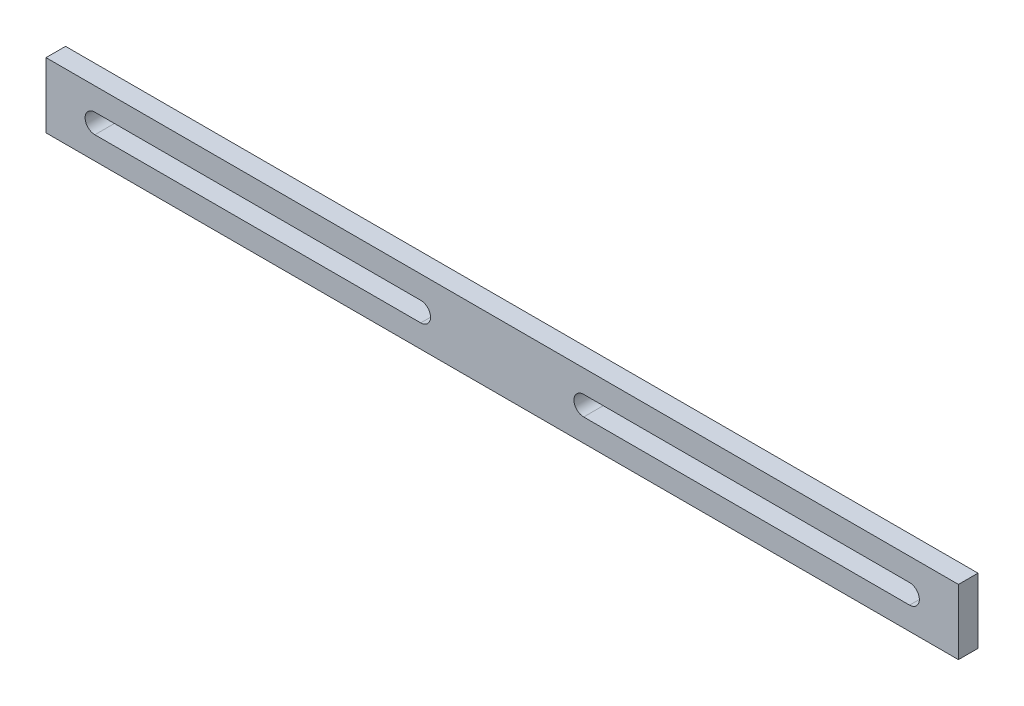
ISO-10303-21;
HEADER;
FILE_DESCRIPTION(('STEP AP214'),'2;1');
FILE_NAME('part.step','',(''),(''),'','','');
FILE_SCHEMA(('AUTOMOTIVE_DESIGN { 1 0 10303 214 1 1 1 1 }'));
ENDSEC;
DATA;
#1=APPLICATION_CONTEXT('core data for automotive mechanical design processes');
#2=APPLICATION_PROTOCOL_DEFINITION('international standard','automotive_design',2000,#1);
#3=PRODUCT_CONTEXT('',#1,'mechanical');
#4=PRODUCT('Part','Part','',(#3));
#5=PRODUCT_RELATED_PRODUCT_CATEGORY('part','',(#4));
#6=PRODUCT_DEFINITION_FORMATION('','',#4);
#7=PRODUCT_DEFINITION_CONTEXT('part definition',#1,'design');
#8=PRODUCT_DEFINITION('design','',#6,#7);
#9=PRODUCT_DEFINITION_SHAPE('','',#8);
#10=(LENGTH_UNIT() NAMED_UNIT(*) SI_UNIT(.MILLI.,.METRE.));
#11=(NAMED_UNIT(*) PLANE_ANGLE_UNIT() SI_UNIT($,.RADIAN.));
#12=(NAMED_UNIT(*) SI_UNIT($,.STERADIAN.) SOLID_ANGLE_UNIT());
#13=UNCERTAINTY_MEASURE_WITH_UNIT(LENGTH_MEASURE(1.E-05),#10,'distance_accuracy_value','');
#14=(GEOMETRIC_REPRESENTATION_CONTEXT(3) GLOBAL_UNCERTAINTY_ASSIGNED_CONTEXT((#13)) GLOBAL_UNIT_ASSIGNED_CONTEXT((#10,
#11,#12)) REPRESENTATION_CONTEXT('',''));
#15=CARTESIAN_POINT('',(0.,0.,0.));
#16=DIRECTION('',(0.,0.,1.));
#17=DIRECTION('',(1.,0.,0.));
#18=AXIS2_PLACEMENT_3D('',#15,#16,#17);
#19=CARTESIAN_POINT('',(0.,0.,6.));
#20=DIRECTION('',(0.,0.,-1.));
#21=DIRECTION('',(-1.,0.,0.));
#22=AXIS2_PLACEMENT_3D('',#19,#20,#21);
#23=PLANE('',#22);
#24=CARTESIAN_POINT('',(15.,10.,6.));
#25=DIRECTION('',(0.,0.,1.));
#26=DIRECTION('',(1.,0.,0.));
#27=AXIS2_PLACEMENT_3D('',#24,#25,#26);
#28=CIRCLE('',#27,3.);
#29=CARTESIAN_POINT('',(15.,13.,6.));
#30=VERTEX_POINT('',#29);
#31=CARTESIAN_POINT('',(15.,7.,6.));
#32=VERTEX_POINT('',#31);
#33=EDGE_CURVE('E166',#30,#32,#28,.T.);
#34=ORIENTED_EDGE('',*,*,#33,.F.);
#35=DIRECTION('',(-1.,0.,0.));
#36=VECTOR('',#35,1.);
#37=CARTESIAN_POINT('',(15.,13.,6.));
#38=LINE('',#37,#36);
#39=CARTESIAN_POINT('',(115.,13.,6.));
#40=VERTEX_POINT('',#39);
#41=EDGE_CURVE('E174',#40,#30,#38,.T.);
#42=ORIENTED_EDGE('',*,*,#41,.F.);
#43=CARTESIAN_POINT('',(115.,10.,6.));
#44=DIRECTION('',(0.,0.,1.));
#45=DIRECTION('',(1.,0.,0.));
#46=AXIS2_PLACEMENT_3D('',#43,#44,#45);
#47=CIRCLE('',#46,3.);
#48=CARTESIAN_POINT('',(115.,7.00000000000002,6.));
#49=VERTEX_POINT('',#48);
#50=EDGE_CURVE('E171',#49,#40,#47,.T.);
#51=ORIENTED_EDGE('',*,*,#50,.F.);
#52=DIRECTION('',(1.,0.,0.));
#53=VECTOR('',#52,1.);
#54=CARTESIAN_POINT('',(15.,7.,6.));
#55=LINE('',#54,#53);
#56=EDGE_CURVE('E168',#32,#49,#55,.T.);
#57=ORIENTED_EDGE('',*,*,#56,.F.);
#58=EDGE_LOOP('',(#34,#42,#51,#57));
#59=FACE_BOUND('',#58,.T.);
#60=DIRECTION('',(0.,-1.,0.));
#61=VECTOR('',#60,1.);
#62=CARTESIAN_POINT('',(0.,0.,6.));
#63=LINE('',#62,#61);
#64=CARTESIAN_POINT('',(0.,20.,6.));
#65=VERTEX_POINT('',#64);
#66=CARTESIAN_POINT('',(0.,0.,6.));
#67=VERTEX_POINT('',#66);
#68=EDGE_CURVE('E197',#65,#67,#63,.T.);
#69=ORIENTED_EDGE('',*,*,#68,.T.);
#70=DIRECTION('',(1.,0.,0.));
#71=VECTOR('',#70,1.);
#72=CARTESIAN_POINT('',(0.,0.,6.));
#73=LINE('',#72,#71);
#74=CARTESIAN_POINT('',(280.,0.,6.));
#75=VERTEX_POINT('',#74);
#76=EDGE_CURVE('E200',#67,#75,#73,.T.);
#77=ORIENTED_EDGE('',*,*,#76,.T.);
#78=DIRECTION('',(0.,1.,0.));
#79=VECTOR('',#78,1.);
#80=CARTESIAN_POINT('',(280.,0.,6.));
#81=LINE('',#80,#79);
#82=CARTESIAN_POINT('',(280.,20.,6.));
#83=VERTEX_POINT('',#82);
#84=EDGE_CURVE('E203',#75,#83,#81,.T.);
#85=ORIENTED_EDGE('',*,*,#84,.T.);
#86=DIRECTION('',(-1.,0.,0.));
#87=VECTOR('',#86,1.);
#88=CARTESIAN_POINT('',(0.,20.,6.));
#89=LINE('',#88,#87);
#90=EDGE_CURVE('E205',#83,#65,#89,.T.);
#91=ORIENTED_EDGE('',*,*,#90,.T.);
#92=EDGE_LOOP('',(#69,#77,#85,#91));
#93=FACE_BOUND('',#92,.T.);
#94=CARTESIAN_POINT('',(265.,9.99999999999999,6.));
#95=DIRECTION('',(0.,0.,1.));
#96=DIRECTION('',(-1.,0.,0.));
#97=AXIS2_PLACEMENT_3D('',#94,#95,#96);
#98=CIRCLE('',#97,3.);
#99=CARTESIAN_POINT('',(265.,6.99999999999999,6.));
#100=VERTEX_POINT('',#99);
#101=CARTESIAN_POINT('',(265.,13.,6.));
#102=VERTEX_POINT('',#101);
#103=EDGE_CURVE('E130',#100,#102,#98,.T.);
#104=ORIENTED_EDGE('',*,*,#103,.F.);
#105=DIRECTION('',(1.,0.,0.));
#106=VECTOR('',#105,1.);
#107=CARTESIAN_POINT('',(265.,6.99999999999999,6.));
#108=LINE('',#107,#106);
#109=CARTESIAN_POINT('',(165.,7.00000000000001,6.));
#110=VERTEX_POINT('',#109);
#111=EDGE_CURVE('E152',#110,#100,#108,.T.);
#112=ORIENTED_EDGE('',*,*,#111,.F.);
#113=CARTESIAN_POINT('',(165.,10.,6.));
#114=DIRECTION('',(0.,0.,1.));
#115=DIRECTION('',(-1.,0.,0.));
#116=AXIS2_PLACEMENT_3D('',#113,#114,#115);
#117=CIRCLE('',#116,3.);
#118=CARTESIAN_POINT('',(165.,13.,6.));
#119=VERTEX_POINT('',#118);
#120=EDGE_CURVE('E150',#119,#110,#117,.T.);
#121=ORIENTED_EDGE('',*,*,#120,.F.);
#122=DIRECTION('',(-1.,0.,0.));
#123=VECTOR('',#122,1.);
#124=CARTESIAN_POINT('',(265.,13.,6.));
#125=LINE('',#124,#123);
#126=EDGE_CURVE('E138',#102,#119,#125,.T.);
#127=ORIENTED_EDGE('',*,*,#126,.F.);
#128=EDGE_LOOP('',(#104,#112,#121,#127));
#129=FACE_BOUND('',#128,.T.);
#130=ADVANCED_FACE('F41',(#59,#93,#129),#23,.F.);
#131=CARTESIAN_POINT('',(0.,0.,0.));
#132=DIRECTION('',(0.,0.,-1.));
#133=DIRECTION('',(-1.,0.,0.));
#134=AXIS2_PLACEMENT_3D('',#131,#132,#133);
#135=PLANE('',#134);
#136=DIRECTION('',(0.,-1.,0.));
#137=VECTOR('',#136,1.);
#138=CARTESIAN_POINT('',(0.,0.,0.));
#139=LINE('',#138,#137);
#140=CARTESIAN_POINT('',(0.,20.,0.));
#141=VERTEX_POINT('',#140);
#142=CARTESIAN_POINT('',(0.,0.,0.));
#143=VERTEX_POINT('',#142);
#144=EDGE_CURVE('E196',#141,#143,#139,.T.);
#145=ORIENTED_EDGE('',*,*,#144,.F.);
#146=DIRECTION('',(-1.,0.,0.));
#147=VECTOR('',#146,1.);
#148=CARTESIAN_POINT('',(0.,20.,0.));
#149=LINE('',#148,#147);
#150=CARTESIAN_POINT('',(280.,20.,0.));
#151=VERTEX_POINT('',#150);
#152=EDGE_CURVE('E201',#151,#141,#149,.T.);
#153=ORIENTED_EDGE('',*,*,#152,.F.);
#154=DIRECTION('',(0.,1.,0.));
#155=VECTOR('',#154,1.);
#156=CARTESIAN_POINT('',(280.,0.,0.));
#157=LINE('',#156,#155);
#158=CARTESIAN_POINT('',(280.,0.,0.));
#159=VERTEX_POINT('',#158);
#160=EDGE_CURVE('E212',#159,#151,#157,.T.);
#161=ORIENTED_EDGE('',*,*,#160,.F.);
#162=DIRECTION('',(1.,0.,0.));
#163=VECTOR('',#162,1.);
#164=CARTESIAN_POINT('',(0.,0.,0.));
#165=LINE('',#164,#163);
#166=EDGE_CURVE('E210',#143,#159,#165,.T.);
#167=ORIENTED_EDGE('',*,*,#166,.F.);
#168=EDGE_LOOP('',(#145,#153,#161,#167));
#169=FACE_BOUND('',#168,.T.);
#170=DIRECTION('',(-1.,0.,0.));
#171=VECTOR('',#170,1.);
#172=CARTESIAN_POINT('',(15.,13.,0.));
#173=LINE('',#172,#171);
#174=CARTESIAN_POINT('',(115.,13.,0.));
#175=VERTEX_POINT('',#174);
#176=CARTESIAN_POINT('',(15.,13.,0.));
#177=VERTEX_POINT('',#176);
#178=EDGE_CURVE('E169',#175,#177,#173,.T.);
#179=ORIENTED_EDGE('',*,*,#178,.T.);
#180=CARTESIAN_POINT('',(15.,10.,0.));
#181=DIRECTION('',(0.,0.,1.));
#182=DIRECTION('',(1.,0.,0.));
#183=AXIS2_PLACEMENT_3D('',#180,#181,#182);
#184=CIRCLE('',#183,3.);
#185=CARTESIAN_POINT('',(15.,7.,0.));
#186=VERTEX_POINT('',#185);
#187=EDGE_CURVE('E146',#177,#186,#184,.T.);
#188=ORIENTED_EDGE('',*,*,#187,.T.);
#189=DIRECTION('',(1.,0.,0.));
#190=VECTOR('',#189,1.);
#191=CARTESIAN_POINT('',(15.,7.,0.));
#192=LINE('',#191,#190);
#193=CARTESIAN_POINT('',(115.,7.00000000000002,0.));
#194=VERTEX_POINT('',#193);
#195=EDGE_CURVE('E179',#186,#194,#192,.T.);
#196=ORIENTED_EDGE('',*,*,#195,.T.);
#197=CARTESIAN_POINT('',(115.,10.,0.));
#198=DIRECTION('',(0.,0.,1.));
#199=DIRECTION('',(1.,0.,0.));
#200=AXIS2_PLACEMENT_3D('',#197,#198,#199);
#201=CIRCLE('',#200,3.);
#202=EDGE_CURVE('E182',#194,#175,#201,.T.);
#203=ORIENTED_EDGE('',*,*,#202,.T.);
#204=EDGE_LOOP('',(#179,#188,#196,#203));
#205=FACE_BOUND('',#204,.T.);
#206=DIRECTION('',(1.,0.,0.));
#207=VECTOR('',#206,1.);
#208=CARTESIAN_POINT('',(265.,6.99999999999999,0.));
#209=LINE('',#208,#207);
#210=CARTESIAN_POINT('',(165.,7.00000000000001,0.));
#211=VERTEX_POINT('',#210);
#212=CARTESIAN_POINT('',(265.,6.99999999999999,0.));
#213=VERTEX_POINT('',#212);
#214=EDGE_CURVE('E139',#211,#213,#209,.T.);
#215=ORIENTED_EDGE('',*,*,#214,.T.);
#216=CARTESIAN_POINT('',(265.,9.99999999999999,0.));
#217=DIRECTION('',(0.,0.,1.));
#218=DIRECTION('',(-1.,0.,0.));
#219=AXIS2_PLACEMENT_3D('',#216,#217,#218);
#220=CIRCLE('',#219,3.);
#221=CARTESIAN_POINT('',(265.,13.,0.));
#222=VERTEX_POINT('',#221);
#223=EDGE_CURVE('E64',#213,#222,#220,.T.);
#224=ORIENTED_EDGE('',*,*,#223,.T.);
#225=DIRECTION('',(-1.,0.,0.));
#226=VECTOR('',#225,1.);
#227=CARTESIAN_POINT('',(265.,13.,0.));
#228=LINE('',#227,#226);
#229=CARTESIAN_POINT('',(165.,13.,0.));
#230=VERTEX_POINT('',#229);
#231=EDGE_CURVE('E145',#222,#230,#228,.T.);
#232=ORIENTED_EDGE('',*,*,#231,.T.);
#233=CARTESIAN_POINT('',(165.,10.,0.));
#234=DIRECTION('',(0.,0.,1.));
#235=DIRECTION('',(-1.,0.,0.));
#236=AXIS2_PLACEMENT_3D('',#233,#234,#235);
#237=CIRCLE('',#236,3.);
#238=EDGE_CURVE('E158',#230,#211,#237,.T.);
#239=ORIENTED_EDGE('',*,*,#238,.T.);
#240=EDGE_LOOP('',(#215,#224,#232,#239));
#241=FACE_BOUND('',#240,.T.);
#242=ADVANCED_FACE('F230',(#169,#205,#241),#135,.T.);
#243=CARTESIAN_POINT('',(0.,0.,6.));
#244=DIRECTION('',(1.,0.,0.));
#245=DIRECTION('',(0.,0.,-1.));
#246=AXIS2_PLACEMENT_3D('',#243,#244,#245);
#247=PLANE('',#246);
#248=ORIENTED_EDGE('',*,*,#144,.T.);
#249=DIRECTION('',(0.,0.,-1.));
#250=VECTOR('',#249,1.);
#251=CARTESIAN_POINT('',(0.,0.,6.));
#252=LINE('',#251,#250);
#253=EDGE_CURVE('E11',#67,#143,#252,.T.);
#254=ORIENTED_EDGE('',*,*,#253,.F.);
#255=ORIENTED_EDGE('',*,*,#68,.F.);
#256=DIRECTION('',(0.,0.,-1.));
#257=VECTOR('',#256,1.);
#258=CARTESIAN_POINT('',(0.,20.,6.));
#259=LINE('',#258,#257);
#260=EDGE_CURVE('E207',#65,#141,#259,.T.);
#261=ORIENTED_EDGE('',*,*,#260,.T.);
#262=EDGE_LOOP('',(#248,#254,#255,#261));
#263=FACE_BOUND('',#262,.T.);
#264=ADVANCED_FACE('F43',(#263),#247,.F.);
#265=CARTESIAN_POINT('',(0.,0.,6.));
#266=DIRECTION('',(0.,1.,0.));
#267=DIRECTION('',(0.,0.,1.));
#268=AXIS2_PLACEMENT_3D('',#265,#266,#267);
#269=PLANE('',#268);
#270=ORIENTED_EDGE('',*,*,#166,.T.);
#271=DIRECTION('',(0.,0.,-1.));
#272=VECTOR('',#271,1.);
#273=CARTESIAN_POINT('',(280.,0.,6.));
#274=LINE('',#273,#272);
#275=EDGE_CURVE('E49',#75,#159,#274,.T.);
#276=ORIENTED_EDGE('',*,*,#275,.F.);
#277=ORIENTED_EDGE('',*,*,#76,.F.);
#278=ORIENTED_EDGE('',*,*,#253,.T.);
#279=EDGE_LOOP('',(#270,#276,#277,#278));
#280=FACE_BOUND('',#279,.T.);
#281=ADVANCED_FACE('F240',(#280),#269,.F.);
#282=CARTESIAN_POINT('',(280.,0.,6.));
#283=DIRECTION('',(-1.,0.,0.));
#284=DIRECTION('',(0.,0.,1.));
#285=AXIS2_PLACEMENT_3D('',#282,#283,#284);
#286=PLANE('',#285);
#287=ORIENTED_EDGE('',*,*,#160,.T.);
#288=DIRECTION('',(0.,0.,-1.));
#289=VECTOR('',#288,1.);
#290=CARTESIAN_POINT('',(280.,20.,6.));
#291=LINE('',#290,#289);
#292=EDGE_CURVE('E217',#83,#151,#291,.T.);
#293=ORIENTED_EDGE('',*,*,#292,.F.);
#294=ORIENTED_EDGE('',*,*,#84,.F.);
#295=ORIENTED_EDGE('',*,*,#275,.T.);
#296=EDGE_LOOP('',(#287,#293,#294,#295));
#297=FACE_BOUND('',#296,.T.);
#298=ADVANCED_FACE('F224',(#297),#286,.F.);
#299=CARTESIAN_POINT('',(0.,20.,6.));
#300=DIRECTION('',(0.,-1.,0.));
#301=DIRECTION('',(0.,0.,-1.));
#302=AXIS2_PLACEMENT_3D('',#299,#300,#301);
#303=PLANE('',#302);
#304=ORIENTED_EDGE('',*,*,#152,.T.);
#305=ORIENTED_EDGE('',*,*,#260,.F.);
#306=ORIENTED_EDGE('',*,*,#90,.F.);
#307=ORIENTED_EDGE('',*,*,#292,.T.);
#308=EDGE_LOOP('',(#304,#305,#306,#307));
#309=FACE_BOUND('',#308,.T.);
#310=ADVANCED_FACE('F234',(#309),#303,.F.);
#311=CARTESIAN_POINT('',(15.,10.,6.));
#312=DIRECTION('',(0.,0.,-1.));
#313=DIRECTION('',(-1.,0.,0.));
#314=AXIS2_PLACEMENT_3D('',#311,#312,#313);
#315=CYLINDRICAL_SURFACE('',#314,3.);
#316=ORIENTED_EDGE('',*,*,#187,.F.);
#317=DIRECTION('',(0.,0.,-1.));
#318=VECTOR('',#317,1.);
#319=CARTESIAN_POINT('',(15.,13.,6.));
#320=LINE('',#319,#318);
#321=EDGE_CURVE('E176',#30,#177,#320,.T.);
#322=ORIENTED_EDGE('',*,*,#321,.F.);
#323=ORIENTED_EDGE('',*,*,#33,.T.);
#324=DIRECTION('',(0.,0.,-1.));
#325=VECTOR('',#324,1.);
#326=CARTESIAN_POINT('',(15.,7.,6.));
#327=LINE('',#326,#325);
#328=EDGE_CURVE('E193',#32,#186,#327,.T.);
#329=ORIENTED_EDGE('',*,*,#328,.T.);
#330=EDGE_LOOP('',(#316,#322,#323,#329));
#331=FACE_BOUND('',#330,.T.);
#332=ADVANCED_FACE('F256',(#331),#315,.F.);
#333=CARTESIAN_POINT('',(15.,7.,6.));
#334=DIRECTION('',(0.,1.,0.));
#335=DIRECTION('',(-1.,0.,0.));
#336=AXIS2_PLACEMENT_3D('',#333,#334,#335);
#337=PLANE('',#336);
#338=ORIENTED_EDGE('',*,*,#195,.F.);
#339=ORIENTED_EDGE('',*,*,#328,.F.);
#340=ORIENTED_EDGE('',*,*,#56,.T.);
#341=DIRECTION('',(0.,0.,-1.));
#342=VECTOR('',#341,1.);
#343=CARTESIAN_POINT('',(115.,7.00000000000002,6.));
#344=LINE('',#343,#342);
#345=EDGE_CURVE('E191',#49,#194,#344,.T.);
#346=ORIENTED_EDGE('',*,*,#345,.T.);
#347=EDGE_LOOP('',(#338,#339,#340,#346));
#348=FACE_BOUND('',#347,.T.);
#349=ADVANCED_FACE('F263',(#348),#337,.T.);
#350=CARTESIAN_POINT('',(115.,10.,6.));
#351=DIRECTION('',(0.,0.,-1.));
#352=DIRECTION('',(-1.,0.,0.));
#353=AXIS2_PLACEMENT_3D('',#350,#351,#352);
#354=CYLINDRICAL_SURFACE('',#353,3.);
#355=ORIENTED_EDGE('',*,*,#202,.F.);
#356=ORIENTED_EDGE('',*,*,#345,.F.);
#357=ORIENTED_EDGE('',*,*,#50,.T.);
#358=DIRECTION('',(0.,0.,-1.));
#359=VECTOR('',#358,1.);
#360=CARTESIAN_POINT('',(115.,13.,6.));
#361=LINE('',#360,#359);
#362=EDGE_CURVE('E189',#40,#175,#361,.T.);
#363=ORIENTED_EDGE('',*,*,#362,.T.);
#364=EDGE_LOOP('',(#355,#356,#357,#363));
#365=FACE_BOUND('',#364,.T.);
#366=ADVANCED_FACE('F268',(#365),#354,.F.);
#367=CARTESIAN_POINT('',(15.,13.,6.));
#368=DIRECTION('',(0.,-1.,0.));
#369=DIRECTION('',(1.,0.,0.));
#370=AXIS2_PLACEMENT_3D('',#367,#368,#369);
#371=PLANE('',#370);
#372=ORIENTED_EDGE('',*,*,#178,.F.);
#373=ORIENTED_EDGE('',*,*,#362,.F.);
#374=ORIENTED_EDGE('',*,*,#41,.T.);
#375=ORIENTED_EDGE('',*,*,#321,.T.);
#376=EDGE_LOOP('',(#372,#373,#374,#375));
#377=FACE_BOUND('',#376,.T.);
#378=ADVANCED_FACE('F274',(#377),#371,.T.);
#379=CARTESIAN_POINT('',(265.,9.99999999999999,6.));
#380=DIRECTION('',(0.,0.,-1.));
#381=DIRECTION('',(-1.,0.,0.));
#382=AXIS2_PLACEMENT_3D('',#379,#380,#381);
#383=CYLINDRICAL_SURFACE('',#382,3.);
#384=ORIENTED_EDGE('',*,*,#223,.F.);
#385=DIRECTION('',(0.,0.,-1.));
#386=VECTOR('',#385,1.);
#387=CARTESIAN_POINT('',(265.,6.99999999999999,6.));
#388=LINE('',#387,#386);
#389=EDGE_CURVE('E134',#100,#213,#388,.T.);
#390=ORIENTED_EDGE('',*,*,#389,.F.);
#391=ORIENTED_EDGE('',*,*,#103,.T.);
#392=DIRECTION('',(0.,0.,-1.));
#393=VECTOR('',#392,1.);
#394=CARTESIAN_POINT('',(265.,13.,6.));
#395=LINE('',#394,#393);
#396=EDGE_CURVE('E133',#102,#222,#395,.T.);
#397=ORIENTED_EDGE('',*,*,#396,.T.);
#398=EDGE_LOOP('',(#384,#390,#391,#397));
#399=FACE_BOUND('',#398,.T.);
#400=ADVANCED_FACE('F132',(#399),#383,.F.);
#401=CARTESIAN_POINT('',(265.,13.,6.));
#402=DIRECTION('',(0.,-1.,0.));
#403=DIRECTION('',(1.,0.,0.));
#404=AXIS2_PLACEMENT_3D('',#401,#402,#403);
#405=PLANE('',#404);
#406=ORIENTED_EDGE('',*,*,#231,.F.);
#407=ORIENTED_EDGE('',*,*,#396,.F.);
#408=ORIENTED_EDGE('',*,*,#126,.T.);
#409=DIRECTION('',(0.,0.,-1.));
#410=VECTOR('',#409,1.);
#411=CARTESIAN_POINT('',(165.,13.,6.));
#412=LINE('',#411,#410);
#413=EDGE_CURVE('E147',#119,#230,#412,.T.);
#414=ORIENTED_EDGE('',*,*,#413,.T.);
#415=EDGE_LOOP('',(#406,#407,#408,#414));
#416=FACE_BOUND('',#415,.T.);
#417=ADVANCED_FACE('F142',(#416),#405,.T.);
#418=CARTESIAN_POINT('',(165.,10.,6.));
#419=DIRECTION('',(0.,0.,-1.));
#420=DIRECTION('',(-1.,0.,0.));
#421=AXIS2_PLACEMENT_3D('',#418,#419,#420);
#422=CYLINDRICAL_SURFACE('',#421,3.);
#423=ORIENTED_EDGE('',*,*,#238,.F.);
#424=ORIENTED_EDGE('',*,*,#413,.F.);
#425=ORIENTED_EDGE('',*,*,#120,.T.);
#426=DIRECTION('',(0.,0.,-1.));
#427=VECTOR('',#426,1.);
#428=CARTESIAN_POINT('',(165.,7.00000000000001,6.));
#429=LINE('',#428,#427);
#430=EDGE_CURVE('E56',#110,#211,#429,.T.);
#431=ORIENTED_EDGE('',*,*,#430,.T.);
#432=EDGE_LOOP('',(#423,#424,#425,#431));
#433=FACE_BOUND('',#432,.T.);
#434=ADVANCED_FACE('F293',(#433),#422,.F.);
#435=CARTESIAN_POINT('',(265.,6.99999999999999,6.));
#436=DIRECTION('',(0.,1.,0.));
#437=DIRECTION('',(-1.,0.,0.));
#438=AXIS2_PLACEMENT_3D('',#435,#436,#437);
#439=PLANE('',#438);
#440=ORIENTED_EDGE('',*,*,#214,.F.);
#441=ORIENTED_EDGE('',*,*,#430,.F.);
#442=ORIENTED_EDGE('',*,*,#111,.T.);
#443=ORIENTED_EDGE('',*,*,#389,.T.);
#444=EDGE_LOOP('',(#440,#441,#442,#443));
#445=FACE_BOUND('',#444,.T.);
#446=ADVANCED_FACE('F296',(#445),#439,.T.);
#447=CLOSED_SHELL('',(#130,#242,#264,#281,#298,#310,#332,#349,#366,#378,#400,#417,#434,#446));
#448=MANIFOLD_SOLID_BREP('B2',#447);
#449=ADVANCED_BREP_SHAPE_REPRESENTATION('',(#18,#448),#14);
#450=SHAPE_DEFINITION_REPRESENTATION(#9,#449);
ENDSEC;
END-ISO-10303-21;
